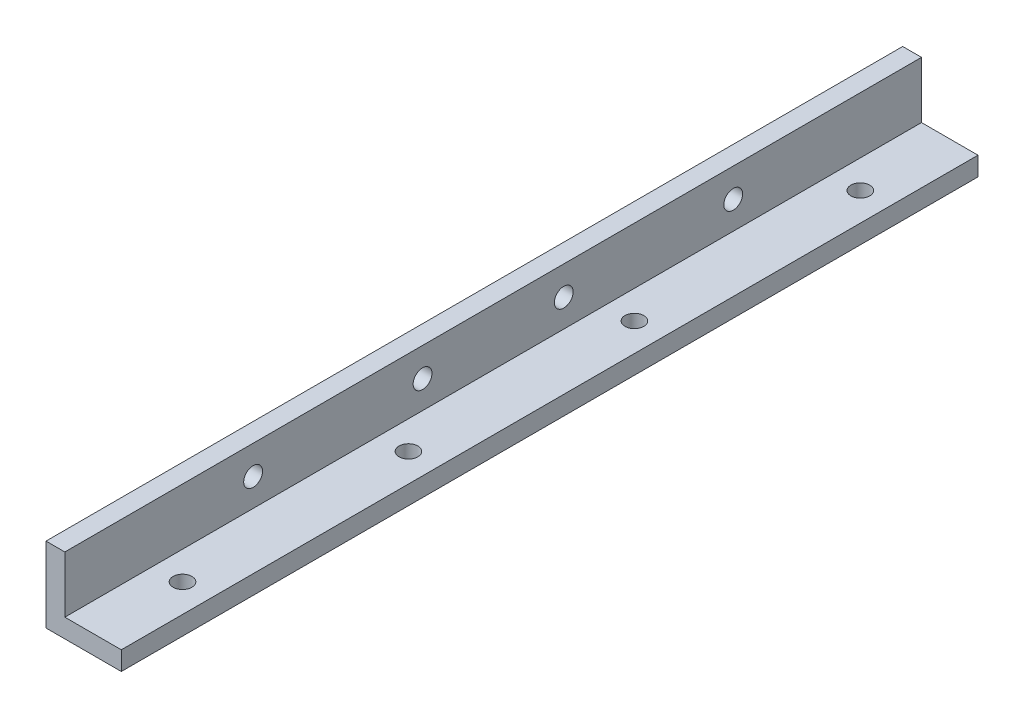
ISO-10303-21;
HEADER;
FILE_DESCRIPTION(('STEP AP214'),'2;1');
FILE_NAME('part.step','',(''),(''),'','','');
FILE_SCHEMA(('AUTOMOTIVE_DESIGN { 1 0 10303 214 1 1 1 1 }'));
ENDSEC;
DATA;
#1=APPLICATION_CONTEXT('core data for automotive mechanical design processes');
#2=APPLICATION_PROTOCOL_DEFINITION('international standard','automotive_design',2000,#1);
#3=PRODUCT_CONTEXT('',#1,'mechanical');
#4=PRODUCT('Part','Part','',(#3));
#5=PRODUCT_RELATED_PRODUCT_CATEGORY('part','',(#4));
#6=PRODUCT_DEFINITION_FORMATION('','',#4);
#7=PRODUCT_DEFINITION_CONTEXT('part definition',#1,'design');
#8=PRODUCT_DEFINITION('design','',#6,#7);
#9=PRODUCT_DEFINITION_SHAPE('','',#8);
#10=(LENGTH_UNIT() NAMED_UNIT(*) SI_UNIT(.MILLI.,.METRE.));
#11=(NAMED_UNIT(*) PLANE_ANGLE_UNIT() SI_UNIT($,.RADIAN.));
#12=(NAMED_UNIT(*) SI_UNIT($,.STERADIAN.) SOLID_ANGLE_UNIT());
#13=UNCERTAINTY_MEASURE_WITH_UNIT(LENGTH_MEASURE(1.E-05),#10,'distance_accuracy_value','');
#14=(GEOMETRIC_REPRESENTATION_CONTEXT(3) GLOBAL_UNCERTAINTY_ASSIGNED_CONTEXT((#13)) GLOBAL_UNIT_ASSIGNED_CONTEXT((#10,
#11,#12)) REPRESENTATION_CONTEXT('',''));
#15=CARTESIAN_POINT('',(0.,0.,0.));
#16=DIRECTION('',(0.,0.,1.));
#17=DIRECTION('',(1.,0.,0.));
#18=AXIS2_PLACEMENT_3D('',#15,#16,#17);
#19=CARTESIAN_POINT('',(0.,0.,227.5));
#20=DIRECTION('',(0.,1.,0.));
#21=DIRECTION('',(0.,0.,1.));
#22=AXIS2_PLACEMENT_3D('',#19,#20,#21);
#23=PLANE('',#22);
#24=CARTESIAN_POINT('',(12.5,0.,203.75));
#25=DIRECTION('',(0.,1.,0.));
#26=DIRECTION('',(0.,0.,1.));
#27=AXIS2_PLACEMENT_3D('',#24,#25,#26);
#28=CIRCLE('',#27,2.5);
#29=CARTESIAN_POINT('',(12.5,0.,206.25));
#30=VERTEX_POINT('',#29);
#31=EDGE_CURVE('E167',#30,#30,#28,.T.);
#32=ORIENTED_EDGE('',*,*,#31,.T.);
#33=EDGE_LOOP('',(#32));
#34=FACE_BOUND('',#33,.T.);
#35=CARTESIAN_POINT('',(12.5,0.,143.75));
#36=DIRECTION('',(0.,1.,0.));
#37=DIRECTION('',(0.,0.,1.));
#38=AXIS2_PLACEMENT_3D('',#35,#36,#37);
#39=CIRCLE('',#38,2.5);
#40=CARTESIAN_POINT('',(12.5,0.,146.25));
#41=VERTEX_POINT('',#40);
#42=EDGE_CURVE('E171',#41,#41,#39,.T.);
#43=ORIENTED_EDGE('',*,*,#42,.T.);
#44=EDGE_LOOP('',(#43));
#45=FACE_BOUND('',#44,.T.);
#46=CARTESIAN_POINT('',(12.5,0.,83.75));
#47=DIRECTION('',(0.,1.,0.));
#48=DIRECTION('',(0.,0.,1.));
#49=AXIS2_PLACEMENT_3D('',#46,#47,#48);
#50=CIRCLE('',#49,2.5);
#51=CARTESIAN_POINT('',(12.5,0.,86.25));
#52=VERTEX_POINT('',#51);
#53=EDGE_CURVE('E175',#52,#52,#50,.T.);
#54=ORIENTED_EDGE('',*,*,#53,.T.);
#55=EDGE_LOOP('',(#54));
#56=FACE_BOUND('',#55,.T.);
#57=CARTESIAN_POINT('',(12.5,0.,23.75));
#58=DIRECTION('',(0.,1.,0.));
#59=DIRECTION('',(0.,0.,1.));
#60=AXIS2_PLACEMENT_3D('',#57,#58,#59);
#61=CIRCLE('',#60,2.5);
#62=CARTESIAN_POINT('',(12.5,0.,26.25));
#63=VERTEX_POINT('',#62);
#64=EDGE_CURVE('E124',#63,#63,#61,.T.);
#65=ORIENTED_EDGE('',*,*,#64,.T.);
#66=EDGE_LOOP('',(#65));
#67=FACE_BOUND('',#66,.T.);
#68=DIRECTION('',(1.,0.,0.));
#69=VECTOR('',#68,1.);
#70=CARTESIAN_POINT('',(0.,0.,0.));
#71=LINE('',#70,#69);
#72=CARTESIAN_POINT('',(0.,0.,0.));
#73=VERTEX_POINT('',#72);
#74=CARTESIAN_POINT('',(20.,0.,0.));
#75=VERTEX_POINT('',#74);
#76=EDGE_CURVE('E121',#73,#75,#71,.T.);
#77=ORIENTED_EDGE('',*,*,#76,.T.);
#78=DIRECTION('',(0.,0.,-1.));
#79=VECTOR('',#78,1.);
#80=CARTESIAN_POINT('',(20.,0.,227.5));
#81=LINE('',#80,#79);
#82=CARTESIAN_POINT('',(20.,0.,227.5));
#83=VERTEX_POINT('',#82);
#84=EDGE_CURVE('E11',#83,#75,#81,.T.);
#85=ORIENTED_EDGE('',*,*,#84,.F.);
#86=DIRECTION('',(1.,0.,0.));
#87=VECTOR('',#86,1.);
#88=CARTESIAN_POINT('',(0.,0.,227.5));
#89=LINE('',#88,#87);
#90=CARTESIAN_POINT('',(0.,0.,227.5));
#91=VERTEX_POINT('',#90);
#92=EDGE_CURVE('E136',#91,#83,#89,.T.);
#93=ORIENTED_EDGE('',*,*,#92,.F.);
#94=DIRECTION('',(0.,0.,-1.));
#95=VECTOR('',#94,1.);
#96=CARTESIAN_POINT('',(0.,0.,227.5));
#97=LINE('',#96,#95);
#98=EDGE_CURVE('E53',#91,#73,#97,.T.);
#99=ORIENTED_EDGE('',*,*,#98,.T.);
#100=EDGE_LOOP('',(#77,#85,#93,#99));
#101=FACE_BOUND('',#100,.T.);
#102=ADVANCED_FACE('F37',(#34,#45,#56,#67,#101),#23,.F.);
#103=CARTESIAN_POINT('',(20.,0.,227.5));
#104=DIRECTION('',(-1.,0.,0.));
#105=DIRECTION('',(0.,0.,1.));
#106=AXIS2_PLACEMENT_3D('',#103,#104,#105);
#107=PLANE('',#106);
#108=DIRECTION('',(0.,1.,0.));
#109=VECTOR('',#108,1.);
#110=CARTESIAN_POINT('',(20.,0.,0.));
#111=LINE('',#110,#109);
#112=CARTESIAN_POINT('',(20.,5.,0.));
#113=VERTEX_POINT('',#112);
#114=EDGE_CURVE('E123',#75,#113,#111,.T.);
#115=ORIENTED_EDGE('',*,*,#114,.T.);
#116=DIRECTION('',(0.,0.,-1.));
#117=VECTOR('',#116,1.);
#118=CARTESIAN_POINT('',(20.,5.,227.5));
#119=LINE('',#118,#117);
#120=CARTESIAN_POINT('',(20.,5.,227.5));
#121=VERTEX_POINT('',#120);
#122=EDGE_CURVE('E45',#121,#113,#119,.T.);
#123=ORIENTED_EDGE('',*,*,#122,.F.);
#124=DIRECTION('',(0.,1.,0.));
#125=VECTOR('',#124,1.);
#126=CARTESIAN_POINT('',(20.,0.,227.5));
#127=LINE('',#126,#125);
#128=EDGE_CURVE('E85',#83,#121,#127,.T.);
#129=ORIENTED_EDGE('',*,*,#128,.F.);
#130=ORIENTED_EDGE('',*,*,#84,.T.);
#131=EDGE_LOOP('',(#115,#123,#129,#130));
#132=FACE_BOUND('',#131,.T.);
#133=ADVANCED_FACE('F142',(#132),#107,.F.);
#134=CARTESIAN_POINT('',(0.,5.,227.5));
#135=DIRECTION('',(0.,1.,0.));
#136=DIRECTION('',(0.,0.,1.));
#137=AXIS2_PLACEMENT_3D('',#134,#135,#136);
#138=PLANE('',#137);
#139=CARTESIAN_POINT('',(12.5,5.,203.75));
#140=DIRECTION('',(0.,1.,0.));
#141=DIRECTION('',(0.,0.,1.));
#142=AXIS2_PLACEMENT_3D('',#139,#140,#141);
#143=CIRCLE('',#142,2.5);
#144=CARTESIAN_POINT('',(12.5,5.,206.25));
#145=VERTEX_POINT('',#144);
#146=EDGE_CURVE('E194',#145,#145,#143,.T.);
#147=ORIENTED_EDGE('',*,*,#146,.F.);
#148=EDGE_LOOP('',(#147));
#149=FACE_BOUND('',#148,.T.);
#150=CARTESIAN_POINT('',(12.5,5.,143.75));
#151=DIRECTION('',(0.,1.,0.));
#152=DIRECTION('',(0.,0.,1.));
#153=AXIS2_PLACEMENT_3D('',#150,#151,#152);
#154=CIRCLE('',#153,2.5);
#155=CARTESIAN_POINT('',(12.5,5.,146.25));
#156=VERTEX_POINT('',#155);
#157=EDGE_CURVE('E190',#156,#156,#154,.T.);
#158=ORIENTED_EDGE('',*,*,#157,.F.);
#159=EDGE_LOOP('',(#158));
#160=FACE_BOUND('',#159,.T.);
#161=CARTESIAN_POINT('',(12.5,5.,83.75));
#162=DIRECTION('',(0.,1.,0.));
#163=DIRECTION('',(0.,0.,1.));
#164=AXIS2_PLACEMENT_3D('',#161,#162,#163);
#165=CIRCLE('',#164,2.5);
#166=CARTESIAN_POINT('',(12.5,5.,86.25));
#167=VERTEX_POINT('',#166);
#168=EDGE_CURVE('E186',#167,#167,#165,.T.);
#169=ORIENTED_EDGE('',*,*,#168,.F.);
#170=EDGE_LOOP('',(#169));
#171=FACE_BOUND('',#170,.T.);
#172=CARTESIAN_POINT('',(12.5,5.,23.75));
#173=DIRECTION('',(0.,1.,0.));
#174=DIRECTION('',(0.,0.,1.));
#175=AXIS2_PLACEMENT_3D('',#172,#173,#174);
#176=CIRCLE('',#175,2.5);
#177=CARTESIAN_POINT('',(12.5,5.,26.25));
#178=VERTEX_POINT('',#177);
#179=EDGE_CURVE('E182',#178,#178,#176,.T.);
#180=ORIENTED_EDGE('',*,*,#179,.F.);
#181=EDGE_LOOP('',(#180));
#182=FACE_BOUND('',#181,.T.);
#183=DIRECTION('',(1.,0.,0.));
#184=VECTOR('',#183,1.);
#185=CARTESIAN_POINT('',(0.,5.,0.));
#186=LINE('',#185,#184);
#187=CARTESIAN_POINT('',(5.,5.,0.));
#188=VERTEX_POINT('',#187);
#189=EDGE_CURVE('E127',#188,#113,#186,.T.);
#190=ORIENTED_EDGE('',*,*,#189,.F.);
#191=DIRECTION('',(0.,0.,-1.));
#192=VECTOR('',#191,1.);
#193=CARTESIAN_POINT('',(5.,5.,227.5));
#194=LINE('',#193,#192);
#195=CARTESIAN_POINT('',(5.,5.,227.5));
#196=VERTEX_POINT('',#195);
#197=EDGE_CURVE('E113',#196,#188,#194,.T.);
#198=ORIENTED_EDGE('',*,*,#197,.F.);
#199=DIRECTION('',(1.,0.,0.));
#200=VECTOR('',#199,1.);
#201=CARTESIAN_POINT('',(0.,5.,227.5));
#202=LINE('',#201,#200);
#203=EDGE_CURVE('E103',#196,#121,#202,.T.);
#204=ORIENTED_EDGE('',*,*,#203,.T.);
#205=ORIENTED_EDGE('',*,*,#122,.T.);
#206=EDGE_LOOP('',(#190,#198,#204,#205));
#207=FACE_BOUND('',#206,.T.);
#208=ADVANCED_FACE('F141',(#149,#160,#171,#182,#207),#138,.T.);
#209=CARTESIAN_POINT('',(5.,0.,227.5));
#210=DIRECTION('',(-1.,0.,0.));
#211=DIRECTION('',(0.,0.,1.));
#212=AXIS2_PLACEMENT_3D('',#209,#210,#211);
#213=PLANE('',#212);
#214=CARTESIAN_POINT('',(5.,12.3461631582441,177.5));
#215=DIRECTION('',(1.,0.,0.));
#216=DIRECTION('',(0.,0.,-1.));
#217=AXIS2_PLACEMENT_3D('',#214,#215,#216);
#218=CIRCLE('',#217,2.5);
#219=CARTESIAN_POINT('',(5.,12.3461631582441,175.));
#220=VERTEX_POINT('',#219);
#221=EDGE_CURVE('E217',#220,#220,#218,.T.);
#222=ORIENTED_EDGE('',*,*,#221,.F.);
#223=EDGE_LOOP('',(#222));
#224=FACE_BOUND('',#223,.T.);
#225=CARTESIAN_POINT('',(5.,12.3461631582441,132.5));
#226=DIRECTION('',(1.,0.,0.));
#227=DIRECTION('',(0.,0.,-1.));
#228=AXIS2_PLACEMENT_3D('',#225,#226,#227);
#229=CIRCLE('',#228,2.5);
#230=CARTESIAN_POINT('',(5.,12.3461631582441,130.));
#231=VERTEX_POINT('',#230);
#232=EDGE_CURVE('E212',#231,#231,#229,.T.);
#233=ORIENTED_EDGE('',*,*,#232,.F.);
#234=EDGE_LOOP('',(#233));
#235=FACE_BOUND('',#234,.T.);
#236=CARTESIAN_POINT('',(5.,12.3461631582441,95.));
#237=DIRECTION('',(1.,0.,0.));
#238=DIRECTION('',(0.,0.,-1.));
#239=AXIS2_PLACEMENT_3D('',#236,#237,#238);
#240=CIRCLE('',#239,2.5);
#241=CARTESIAN_POINT('',(5.,12.3461631582441,92.5));
#242=VERTEX_POINT('',#241);
#243=EDGE_CURVE('E206',#242,#242,#240,.T.);
#244=ORIENTED_EDGE('',*,*,#243,.F.);
#245=EDGE_LOOP('',(#244));
#246=FACE_BOUND('',#245,.T.);
#247=CARTESIAN_POINT('',(5.,12.3461631582441,50.));
#248=DIRECTION('',(1.,0.,0.));
#249=DIRECTION('',(0.,0.,-1.));
#250=AXIS2_PLACEMENT_3D('',#247,#248,#249);
#251=CIRCLE('',#250,2.5);
#252=CARTESIAN_POINT('',(5.,12.3461631582441,47.5));
#253=VERTEX_POINT('',#252);
#254=EDGE_CURVE('E200',#253,#253,#251,.T.);
#255=ORIENTED_EDGE('',*,*,#254,.F.);
#256=EDGE_LOOP('',(#255));
#257=FACE_BOUND('',#256,.T.);
#258=DIRECTION('',(0.,1.,0.));
#259=VECTOR('',#258,1.);
#260=CARTESIAN_POINT('',(5.,0.,0.));
#261=LINE('',#260,#259);
#262=CARTESIAN_POINT('',(5.,20.,0.));
#263=VERTEX_POINT('',#262);
#264=EDGE_CURVE('E110',#188,#263,#261,.T.);
#265=ORIENTED_EDGE('',*,*,#264,.T.);
#266=DIRECTION('',(0.,0.,-1.));
#267=VECTOR('',#266,1.);
#268=CARTESIAN_POINT('',(5.,20.,227.5));
#269=LINE('',#268,#267);
#270=CARTESIAN_POINT('',(5.,20.,227.5));
#271=VERTEX_POINT('',#270);
#272=EDGE_CURVE('E107',#271,#263,#269,.T.);
#273=ORIENTED_EDGE('',*,*,#272,.F.);
#274=DIRECTION('',(0.,1.,0.));
#275=VECTOR('',#274,1.);
#276=CARTESIAN_POINT('',(5.,0.,227.5));
#277=LINE('',#276,#275);
#278=EDGE_CURVE('E96',#196,#271,#277,.T.);
#279=ORIENTED_EDGE('',*,*,#278,.F.);
#280=ORIENTED_EDGE('',*,*,#197,.T.);
#281=EDGE_LOOP('',(#265,#273,#279,#280));
#282=FACE_BOUND('',#281,.T.);
#283=ADVANCED_FACE('F108',(#224,#235,#246,#257,#282),#213,.F.);
#284=CARTESIAN_POINT('',(0.,20.,227.5));
#285=DIRECTION('',(0.,1.,0.));
#286=DIRECTION('',(0.,0.,1.));
#287=AXIS2_PLACEMENT_3D('',#284,#285,#286);
#288=PLANE('',#287);
#289=DIRECTION('',(1.,0.,0.));
#290=VECTOR('',#289,1.);
#291=CARTESIAN_POINT('',(0.,20.,0.));
#292=LINE('',#291,#290);
#293=CARTESIAN_POINT('',(0.,20.,0.));
#294=VERTEX_POINT('',#293);
#295=EDGE_CURVE('E131',#294,#263,#292,.T.);
#296=ORIENTED_EDGE('',*,*,#295,.F.);
#297=DIRECTION('',(0.,0.,-1.));
#298=VECTOR('',#297,1.);
#299=CARTESIAN_POINT('',(0.,20.,227.5));
#300=LINE('',#299,#298);
#301=CARTESIAN_POINT('',(0.,20.,227.5));
#302=VERTEX_POINT('',#301);
#303=EDGE_CURVE('E73',#302,#294,#300,.T.);
#304=ORIENTED_EDGE('',*,*,#303,.F.);
#305=DIRECTION('',(1.,0.,0.));
#306=VECTOR('',#305,1.);
#307=CARTESIAN_POINT('',(0.,20.,227.5));
#308=LINE('',#307,#306);
#309=EDGE_CURVE('E101',#302,#271,#308,.T.);
#310=ORIENTED_EDGE('',*,*,#309,.T.);
#311=ORIENTED_EDGE('',*,*,#272,.T.);
#312=EDGE_LOOP('',(#296,#304,#310,#311));
#313=FACE_BOUND('',#312,.T.);
#314=ADVANCED_FACE('F115',(#313),#288,.T.);
#315=CARTESIAN_POINT('',(0.,0.,227.5));
#316=DIRECTION('',(-1.,0.,0.));
#317=DIRECTION('',(0.,0.,1.));
#318=AXIS2_PLACEMENT_3D('',#315,#316,#317);
#319=PLANE('',#318);
#320=CARTESIAN_POINT('',(0.,12.3461631582441,177.5));
#321=DIRECTION('',(1.,0.,0.));
#322=DIRECTION('',(0.,0.,-1.));
#323=AXIS2_PLACEMENT_3D('',#320,#321,#322);
#324=CIRCLE('',#323,2.5);
#325=CARTESIAN_POINT('',(0.,12.3461631582441,175.));
#326=VERTEX_POINT('',#325);
#327=EDGE_CURVE('E215',#326,#326,#324,.T.);
#328=ORIENTED_EDGE('',*,*,#327,.T.);
#329=EDGE_LOOP('',(#328));
#330=FACE_BOUND('',#329,.T.);
#331=CARTESIAN_POINT('',(0.,12.3461631582441,132.5));
#332=DIRECTION('',(1.,0.,0.));
#333=DIRECTION('',(0.,0.,-1.));
#334=AXIS2_PLACEMENT_3D('',#331,#332,#333);
#335=CIRCLE('',#334,2.5);
#336=CARTESIAN_POINT('',(0.,12.3461631582441,130.));
#337=VERTEX_POINT('',#336);
#338=EDGE_CURVE('E209',#337,#337,#335,.T.);
#339=ORIENTED_EDGE('',*,*,#338,.T.);
#340=EDGE_LOOP('',(#339));
#341=FACE_BOUND('',#340,.T.);
#342=CARTESIAN_POINT('',(0.,12.3461631582441,95.));
#343=DIRECTION('',(1.,0.,0.));
#344=DIRECTION('',(0.,0.,-1.));
#345=AXIS2_PLACEMENT_3D('',#342,#343,#344);
#346=CIRCLE('',#345,2.5);
#347=CARTESIAN_POINT('',(0.,12.3461631582441,92.5));
#348=VERTEX_POINT('',#347);
#349=EDGE_CURVE('E203',#348,#348,#346,.T.);
#350=ORIENTED_EDGE('',*,*,#349,.T.);
#351=EDGE_LOOP('',(#350));
#352=FACE_BOUND('',#351,.T.);
#353=CARTESIAN_POINT('',(0.,12.3461631582441,50.));
#354=DIRECTION('',(1.,0.,0.));
#355=DIRECTION('',(0.,0.,-1.));
#356=AXIS2_PLACEMENT_3D('',#353,#354,#355);
#357=CIRCLE('',#356,2.5);
#358=CARTESIAN_POINT('',(0.,12.3461631582441,47.5));
#359=VERTEX_POINT('',#358);
#360=EDGE_CURVE('E197',#359,#359,#357,.T.);
#361=ORIENTED_EDGE('',*,*,#360,.T.);
#362=EDGE_LOOP('',(#361));
#363=FACE_BOUND('',#362,.T.);
#364=DIRECTION('',(0.,1.,0.));
#365=VECTOR('',#364,1.);
#366=CARTESIAN_POINT('',(0.,0.,0.));
#367=LINE('',#366,#365);
#368=EDGE_CURVE('E133',#73,#294,#367,.T.);
#369=ORIENTED_EDGE('',*,*,#368,.F.);
#370=ORIENTED_EDGE('',*,*,#98,.F.);
#371=DIRECTION('',(0.,1.,0.));
#372=VECTOR('',#371,1.);
#373=CARTESIAN_POINT('',(0.,0.,227.5));
#374=LINE('',#373,#372);
#375=EDGE_CURVE('E116',#91,#302,#374,.T.);
#376=ORIENTED_EDGE('',*,*,#375,.T.);
#377=ORIENTED_EDGE('',*,*,#303,.T.);
#378=EDGE_LOOP('',(#369,#370,#376,#377));
#379=FACE_BOUND('',#378,.T.);
#380=ADVANCED_FACE('F146',(#330,#341,#352,#363,#379),#319,.T.);
#381=CARTESIAN_POINT('',(0.,0.,227.5));
#382=DIRECTION('',(0.,0.,1.));
#383=DIRECTION('',(1.,0.,0.));
#384=AXIS2_PLACEMENT_3D('',#381,#382,#383);
#385=PLANE('',#384);
#386=ORIENTED_EDGE('',*,*,#92,.T.);
#387=ORIENTED_EDGE('',*,*,#128,.T.);
#388=ORIENTED_EDGE('',*,*,#203,.F.);
#389=ORIENTED_EDGE('',*,*,#278,.T.);
#390=ORIENTED_EDGE('',*,*,#309,.F.);
#391=ORIENTED_EDGE('',*,*,#375,.F.);
#392=EDGE_LOOP('',(#386,#387,#388,#389,#390,#391));
#393=FACE_BOUND('',#392,.T.);
#394=ADVANCED_FACE('F98',(#393),#385,.T.);
#395=CARTESIAN_POINT('',(0.,0.,0.));
#396=DIRECTION('',(0.,0.,1.));
#397=DIRECTION('',(1.,0.,0.));
#398=AXIS2_PLACEMENT_3D('',#395,#396,#397);
#399=PLANE('',#398);
#400=ORIENTED_EDGE('',*,*,#76,.F.);
#401=ORIENTED_EDGE('',*,*,#368,.T.);
#402=ORIENTED_EDGE('',*,*,#295,.T.);
#403=ORIENTED_EDGE('',*,*,#264,.F.);
#404=ORIENTED_EDGE('',*,*,#189,.T.);
#405=ORIENTED_EDGE('',*,*,#114,.F.);
#406=EDGE_LOOP('',(#400,#401,#402,#403,#404,#405));
#407=FACE_BOUND('',#406,.T.);
#408=ADVANCED_FACE('F145',(#407),#399,.F.);
#409=CARTESIAN_POINT('',(12.5,5.,23.75));
#410=DIRECTION('',(0.,1.,0.));
#411=DIRECTION('',(0.,0.,1.));
#412=AXIS2_PLACEMENT_3D('',#409,#410,#411);
#413=CYLINDRICAL_SURFACE('',#412,2.5);
#414=ORIENTED_EDGE('',*,*,#64,.F.);
#415=EDGE_LOOP('',(#414));
#416=FACE_BOUND('',#415,.T.);
#417=ORIENTED_EDGE('',*,*,#179,.T.);
#418=EDGE_LOOP('',(#417));
#419=FACE_BOUND('',#418,.T.);
#420=ADVANCED_FACE('F257',(#416,#419),#413,.F.);
#421=CARTESIAN_POINT('',(12.5,5.,83.75));
#422=DIRECTION('',(0.,1.,0.));
#423=DIRECTION('',(0.,0.,1.));
#424=AXIS2_PLACEMENT_3D('',#421,#422,#423);
#425=CYLINDRICAL_SURFACE('',#424,2.5);
#426=ORIENTED_EDGE('',*,*,#53,.F.);
#427=EDGE_LOOP('',(#426));
#428=FACE_BOUND('',#427,.T.);
#429=ORIENTED_EDGE('',*,*,#168,.T.);
#430=EDGE_LOOP('',(#429));
#431=FACE_BOUND('',#430,.T.);
#432=ADVANCED_FACE('F253',(#428,#431),#425,.F.);
#433=CARTESIAN_POINT('',(12.5,5.,143.75));
#434=DIRECTION('',(0.,1.,0.));
#435=DIRECTION('',(0.,0.,1.));
#436=AXIS2_PLACEMENT_3D('',#433,#434,#435);
#437=CYLINDRICAL_SURFACE('',#436,2.5);
#438=ORIENTED_EDGE('',*,*,#42,.F.);
#439=EDGE_LOOP('',(#438));
#440=FACE_BOUND('',#439,.T.);
#441=ORIENTED_EDGE('',*,*,#157,.T.);
#442=EDGE_LOOP('',(#441));
#443=FACE_BOUND('',#442,.T.);
#444=ADVANCED_FACE('F245',(#440,#443),#437,.F.);
#445=CARTESIAN_POINT('',(12.5,5.,203.75));
#446=DIRECTION('',(0.,1.,0.));
#447=DIRECTION('',(0.,0.,1.));
#448=AXIS2_PLACEMENT_3D('',#445,#446,#447);
#449=CYLINDRICAL_SURFACE('',#448,2.5);
#450=ORIENTED_EDGE('',*,*,#31,.F.);
#451=EDGE_LOOP('',(#450));
#452=FACE_BOUND('',#451,.T.);
#453=ORIENTED_EDGE('',*,*,#146,.T.);
#454=EDGE_LOOP('',(#453));
#455=FACE_BOUND('',#454,.T.);
#456=ADVANCED_FACE('F235',(#452,#455),#449,.F.);
#457=CARTESIAN_POINT('',(5.,12.3461631582441,50.));
#458=DIRECTION('',(1.,0.,0.));
#459=DIRECTION('',(0.,0.,-1.));
#460=AXIS2_PLACEMENT_3D('',#457,#458,#459);
#461=CYLINDRICAL_SURFACE('',#460,2.5);
#462=ORIENTED_EDGE('',*,*,#360,.F.);
#463=EDGE_LOOP('',(#462));
#464=FACE_BOUND('',#463,.T.);
#465=ORIENTED_EDGE('',*,*,#254,.T.);
#466=EDGE_LOOP('',(#465));
#467=FACE_BOUND('',#466,.T.);
#468=ADVANCED_FACE('F232',(#464,#467),#461,.F.);
#469=CARTESIAN_POINT('',(5.,12.3461631582441,95.));
#470=DIRECTION('',(1.,0.,0.));
#471=DIRECTION('',(0.,0.,-1.));
#472=AXIS2_PLACEMENT_3D('',#469,#470,#471);
#473=CYLINDRICAL_SURFACE('',#472,2.5);
#474=ORIENTED_EDGE('',*,*,#349,.F.);
#475=EDGE_LOOP('',(#474));
#476=FACE_BOUND('',#475,.T.);
#477=ORIENTED_EDGE('',*,*,#243,.T.);
#478=EDGE_LOOP('',(#477));
#479=FACE_BOUND('',#478,.T.);
#480=ADVANCED_FACE('F234',(#476,#479),#473,.F.);
#481=CARTESIAN_POINT('',(5.,12.3461631582441,132.5));
#482=DIRECTION('',(1.,0.,0.));
#483=DIRECTION('',(0.,0.,-1.));
#484=AXIS2_PLACEMENT_3D('',#481,#482,#483);
#485=CYLINDRICAL_SURFACE('',#484,2.5);
#486=ORIENTED_EDGE('',*,*,#338,.F.);
#487=EDGE_LOOP('',(#486));
#488=FACE_BOUND('',#487,.T.);
#489=ORIENTED_EDGE('',*,*,#232,.T.);
#490=EDGE_LOOP('',(#489));
#491=FACE_BOUND('',#490,.T.);
#492=ADVANCED_FACE('F242',(#488,#491),#485,.F.);
#493=CARTESIAN_POINT('',(5.,12.3461631582441,177.5));
#494=DIRECTION('',(1.,0.,0.));
#495=DIRECTION('',(0.,0.,-1.));
#496=AXIS2_PLACEMENT_3D('',#493,#494,#495);
#497=CYLINDRICAL_SURFACE('',#496,2.5);
#498=ORIENTED_EDGE('',*,*,#327,.F.);
#499=EDGE_LOOP('',(#498));
#500=FACE_BOUND('',#499,.T.);
#501=ORIENTED_EDGE('',*,*,#221,.T.);
#502=EDGE_LOOP('',(#501));
#503=FACE_BOUND('',#502,.T.);
#504=ADVANCED_FACE('F221',(#500,#503),#497,.F.);
#505=CLOSED_SHELL('',(#102,#133,#208,#283,#314,#380,#394,#408,#420,#432,#444,#456,#468,#480,
#492,#504));
#506=MANIFOLD_SOLID_BREP('B2',#505);
#507=ADVANCED_BREP_SHAPE_REPRESENTATION('',(#18,#506),#14);
#508=SHAPE_DEFINITION_REPRESENTATION(#9,#507);
ENDSEC;
END-ISO-10303-21;
